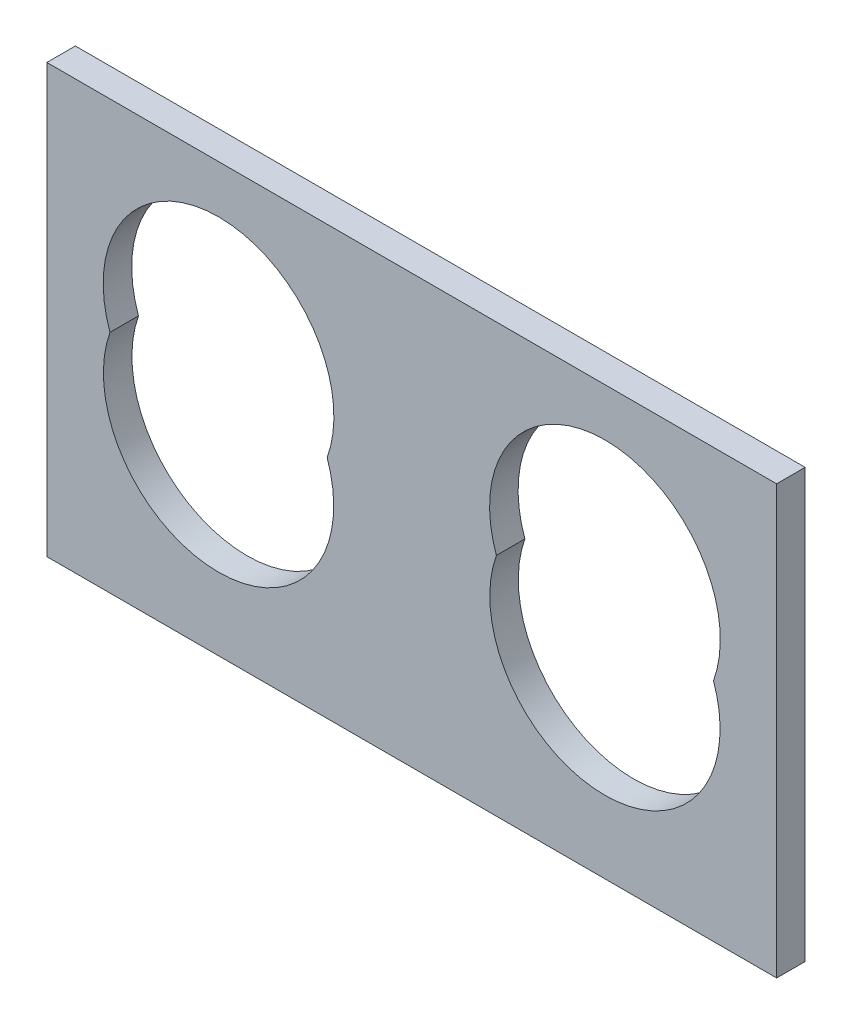
ISO-10303-21;
HEADER;
FILE_DESCRIPTION(('STEP AP214'),'2;1');
FILE_NAME('part.step','',(''),(''),'','','');
FILE_SCHEMA(('AUTOMOTIVE_DESIGN { 1 0 10303 214 1 1 1 1 }'));
ENDSEC;
DATA;
#1=APPLICATION_CONTEXT('core data for automotive mechanical design processes');
#2=APPLICATION_PROTOCOL_DEFINITION('international standard','automotive_design',2000,#1);
#3=PRODUCT_CONTEXT('',#1,'mechanical');
#4=PRODUCT('Part','Part','',(#3));
#5=PRODUCT_RELATED_PRODUCT_CATEGORY('part','',(#4));
#6=PRODUCT_DEFINITION_FORMATION('','',#4);
#7=PRODUCT_DEFINITION_CONTEXT('part definition',#1,'design');
#8=PRODUCT_DEFINITION('design','',#6,#7);
#9=PRODUCT_DEFINITION_SHAPE('','',#8);
#10=(LENGTH_UNIT() NAMED_UNIT(*) SI_UNIT(.MILLI.,.METRE.));
#11=(NAMED_UNIT(*) PLANE_ANGLE_UNIT() SI_UNIT($,.RADIAN.));
#12=(NAMED_UNIT(*) SI_UNIT($,.STERADIAN.) SOLID_ANGLE_UNIT());
#13=UNCERTAINTY_MEASURE_WITH_UNIT(LENGTH_MEASURE(1.E-05),#10,'distance_accuracy_value','');
#14=(GEOMETRIC_REPRESENTATION_CONTEXT(3) GLOBAL_UNCERTAINTY_ASSIGNED_CONTEXT((#13)) GLOBAL_UNIT_ASSIGNED_CONTEXT((#10,
#11,#12)) REPRESENTATION_CONTEXT('',''));
#15=CARTESIAN_POINT('',(0.,0.,0.));
#16=DIRECTION('',(0.,0.,1.));
#17=DIRECTION('',(1.,0.,0.));
#18=AXIS2_PLACEMENT_3D('',#15,#16,#17);
#19=CARTESIAN_POINT('',(-4.50000190126662,2.42973090307518,5.));
#20=DIRECTION('',(0.,0.,-1.));
#21=DIRECTION('',(-1.,0.,0.));
#22=AXIS2_PLACEMENT_3D('',#19,#20,#21);
#23=CYLINDRICAL_SURFACE('',#22,20.1998483211657);
#24=CARTESIAN_POINT('',(-4.50000190126662,2.42973090307518,0.));
#25=DIRECTION('',(0.,0.,1.));
#26=DIRECTION('',(1.,0.,0.));
#27=AXIS2_PLACEMENT_3D('',#24,#25,#26);
#28=CIRCLE('',#27,20.1998483211657);
#29=CARTESIAN_POINT('',(-23.5464817883785,9.15769315831589,0.));
#30=VERTEX_POINT('',#29);
#31=CARTESIAN_POINT('',(14.5464383030136,9.15780549710871,0.));
#32=VERTEX_POINT('',#31);
#33=EDGE_CURVE('E159',#30,#32,#28,.T.);
#34=ORIENTED_EDGE('',*,*,#33,.F.);
#35=DIRECTION('',(0.,0.,-1.));
#36=VECTOR('',#35,1.);
#37=CARTESIAN_POINT('',(-23.5464817883785,9.15769315831589,5.));
#38=LINE('',#37,#36);
#39=CARTESIAN_POINT('',(-23.5464817883785,9.15769315831589,5.));
#40=VERTEX_POINT('',#39);
#41=EDGE_CURVE('E11',#40,#30,#38,.T.);
#42=ORIENTED_EDGE('',*,*,#41,.F.);
#43=CARTESIAN_POINT('',(-4.50000190126662,2.42973090307518,5.));
#44=DIRECTION('',(0.,0.,1.));
#45=DIRECTION('',(1.,0.,0.));
#46=AXIS2_PLACEMENT_3D('',#43,#44,#45);
#47=CIRCLE('',#46,20.1998483211657);
#48=CARTESIAN_POINT('',(14.5464383030136,9.15780549710871,5.));
#49=VERTEX_POINT('',#48);
#50=EDGE_CURVE('E117',#40,#49,#47,.T.);
#51=ORIENTED_EDGE('',*,*,#50,.T.);
#52=DIRECTION('',(0.,0.,-1.));
#53=VECTOR('',#52,1.);
#54=CARTESIAN_POINT('',(14.5464383030136,9.15780549710871,5.));
#55=LINE('',#54,#53);
#56=EDGE_CURVE('E45',#49,#32,#55,.T.);
#57=ORIENTED_EDGE('',*,*,#56,.T.);
#58=EDGE_LOOP('',(#34,#42,#51,#57));
#59=FACE_BOUND('',#58,.T.);
#60=ADVANCED_FACE('F35',(#59),#23,.F.);
#61=CARTESIAN_POINT('',(0.,44.6200004768371,5.));
#62=DIRECTION('',(0.,1.,0.));
#63=DIRECTION('',(0.,0.,1.));
#64=AXIS2_PLACEMENT_3D('',#61,#62,#63);
#65=PLANE('',#64);
#66=DIRECTION('',(1.,0.,0.));
#67=VECTOR('',#66,1.);
#68=CARTESIAN_POINT('',(0.,44.6200004768371,0.));
#69=LINE('',#68,#67);
#70=CARTESIAN_POINT('',(-34.6200007003546,44.6200004768371,0.));
#71=VERTEX_POINT('',#70);
#72=CARTESIAN_POINT('',(93.404548556018,44.6200004768371,0.));
#73=VERTEX_POINT('',#72);
#74=EDGE_CURVE('E150',#71,#73,#69,.T.);
#75=ORIENTED_EDGE('',*,*,#74,.F.);
#76=DIRECTION('',(0.,0.,-1.));
#77=VECTOR('',#76,1.);
#78=CARTESIAN_POINT('',(-34.6200007003546,44.6200004768371,5.));
#79=LINE('',#78,#77);
#80=CARTESIAN_POINT('',(-34.6200007003546,44.6200004768371,5.));
#81=VERTEX_POINT('',#80);
#82=EDGE_CURVE('E129',#81,#71,#79,.T.);
#83=ORIENTED_EDGE('',*,*,#82,.F.);
#84=DIRECTION('',(1.,0.,0.));
#85=VECTOR('',#84,1.);
#86=CARTESIAN_POINT('',(0.,44.6200004768371,5.));
#87=LINE('',#86,#85);
#88=CARTESIAN_POINT('',(93.404548556018,44.6200004768371,5.));
#89=VERTEX_POINT('',#88);
#90=EDGE_CURVE('E110',#81,#89,#87,.T.);
#91=ORIENTED_EDGE('',*,*,#90,.T.);
#92=DIRECTION('',(0.,0.,-1.));
#93=VECTOR('',#92,1.);
#94=CARTESIAN_POINT('',(93.404548556018,44.6200004768371,5.));
#95=LINE('',#94,#93);
#96=EDGE_CURVE('E120',#89,#73,#95,.T.);
#97=ORIENTED_EDGE('',*,*,#96,.T.);
#98=EDGE_LOOP('',(#75,#83,#91,#97));
#99=FACE_BOUND('',#98,.T.);
#100=ADVANCED_FACE('F128',(#99),#65,.T.);
#101=CARTESIAN_POINT('',(-34.6200007003546,0.,5.));
#102=DIRECTION('',(-1.,0.,0.));
#103=DIRECTION('',(0.,0.,1.));
#104=AXIS2_PLACEMENT_3D('',#101,#102,#103);
#105=PLANE('',#104);
#106=DIRECTION('',(0.,1.,0.));
#107=VECTOR('',#106,1.);
#108=CARTESIAN_POINT('',(-34.6200007003546,0.,0.));
#109=LINE('',#108,#107);
#110=CARTESIAN_POINT('',(-34.6200007003546,-30.4650000286103,0.));
#111=VERTEX_POINT('',#110);
#112=EDGE_CURVE('E152',#111,#71,#109,.T.);
#113=ORIENTED_EDGE('',*,*,#112,.F.);
#114=DIRECTION('',(0.,0.,-1.));
#115=VECTOR('',#114,1.);
#116=CARTESIAN_POINT('',(-34.6200007003546,-30.4650000286103,5.));
#117=LINE('',#116,#115);
#118=CARTESIAN_POINT('',(-34.6200007003546,-30.4650000286103,5.));
#119=VERTEX_POINT('',#118);
#120=EDGE_CURVE('E166',#119,#111,#117,.T.);
#121=ORIENTED_EDGE('',*,*,#120,.F.);
#122=DIRECTION('',(0.,1.,0.));
#123=VECTOR('',#122,1.);
#124=CARTESIAN_POINT('',(-34.6200007003546,0.,5.));
#125=LINE('',#124,#123);
#126=EDGE_CURVE('E130',#119,#81,#125,.T.);
#127=ORIENTED_EDGE('',*,*,#126,.T.);
#128=ORIENTED_EDGE('',*,*,#82,.T.);
#129=EDGE_LOOP('',(#113,#121,#127,#128));
#130=FACE_BOUND('',#129,.T.);
#131=ADVANCED_FACE('F192',(#130),#105,.T.);
#132=CARTESIAN_POINT('',(0.,-30.4650000286103,5.));
#133=DIRECTION('',(0.,1.,0.));
#134=DIRECTION('',(0.,0.,1.));
#135=AXIS2_PLACEMENT_3D('',#132,#133,#134);
#136=PLANE('',#135);
#137=DIRECTION('',(1.,0.,0.));
#138=VECTOR('',#137,1.);
#139=CARTESIAN_POINT('',(0.,-30.4650000286103,0.));
#140=LINE('',#139,#138);
#141=CARTESIAN_POINT('',(93.404548556018,-30.4650000286103,0.));
#142=VERTEX_POINT('',#141);
#143=EDGE_CURVE('E155',#111,#142,#140,.T.);
#144=ORIENTED_EDGE('',*,*,#143,.T.);
#145=DIRECTION('',(0.,0.,-1.));
#146=VECTOR('',#145,1.);
#147=CARTESIAN_POINT('',(93.404548556018,-30.4650000286103,5.));
#148=LINE('',#147,#146);
#149=CARTESIAN_POINT('',(93.404548556018,-30.4650000286103,5.));
#150=VERTEX_POINT('',#149);
#151=EDGE_CURVE('E126',#150,#142,#148,.T.);
#152=ORIENTED_EDGE('',*,*,#151,.F.);
#153=DIRECTION('',(1.,0.,0.));
#154=VECTOR('',#153,1.);
#155=CARTESIAN_POINT('',(0.,-30.4650000286103,5.));
#156=LINE('',#155,#154);
#157=EDGE_CURVE('E113',#119,#150,#156,.T.);
#158=ORIENTED_EDGE('',*,*,#157,.F.);
#159=ORIENTED_EDGE('',*,*,#120,.T.);
#160=EDGE_LOOP('',(#144,#152,#158,#159));
#161=FACE_BOUND('',#160,.T.);
#162=ADVANCED_FACE('F197',(#161),#136,.F.);
#163=CARTESIAN_POINT('',(63.2845897595525,15.9942054839587,5.));
#164=DIRECTION('',(0.,0.,-1.));
#165=DIRECTION('',(-1.,0.,0.));
#166=AXIS2_PLACEMENT_3D('',#163,#164,#165);
#167=CYLINDRICAL_SURFACE('',#166,20.2362242785589);
#168=CARTESIAN_POINT('',(63.2845897595525,15.9942054839587,0.));
#169=DIRECTION('',(0.,0.,1.));
#170=DIRECTION('',(1.,0.,0.));
#171=AXIS2_PLACEMENT_3D('',#168,#169,#170);
#172=CIRCLE('',#171,20.2362242785589);
#173=CARTESIAN_POINT('',(82.3310296440419,9.15769315831588,0.));
#174=VERTEX_POINT('',#173);
#175=CARTESIAN_POINT('',(44.2381095526499,9.15780549710872,0.));
#176=VERTEX_POINT('',#175);
#177=EDGE_CURVE('E144',#174,#176,#172,.T.);
#178=ORIENTED_EDGE('',*,*,#177,.F.);
#179=DIRECTION('',(0.,0.,-1.));
#180=VECTOR('',#179,1.);
#181=CARTESIAN_POINT('',(82.3310296440419,9.15769315831588,5.));
#182=LINE('',#181,#180);
#183=CARTESIAN_POINT('',(82.3310296440419,9.15769315831588,5.));
#184=VERTEX_POINT('',#183);
#185=EDGE_CURVE('E39',#184,#174,#182,.T.);
#186=ORIENTED_EDGE('',*,*,#185,.F.);
#187=CARTESIAN_POINT('',(63.2845897595525,15.9942054839587,5.));
#188=DIRECTION('',(0.,0.,1.));
#189=DIRECTION('',(1.,0.,0.));
#190=AXIS2_PLACEMENT_3D('',#187,#188,#189);
#191=CIRCLE('',#190,20.2362242785589);
#192=CARTESIAN_POINT('',(44.2381095526499,9.15780549710872,5.));
#193=VERTEX_POINT('',#192);
#194=EDGE_CURVE('E135',#184,#193,#191,.T.);
#195=ORIENTED_EDGE('',*,*,#194,.T.);
#196=DIRECTION('',(0.,0.,-1.));
#197=VECTOR('',#196,1.);
#198=CARTESIAN_POINT('',(44.2381095526499,9.15780549710872,5.));
#199=LINE('',#198,#197);
#200=EDGE_CURVE('E143',#193,#176,#199,.T.);
#201=ORIENTED_EDGE('',*,*,#200,.T.);
#202=EDGE_LOOP('',(#178,#186,#195,#201));
#203=FACE_BOUND('',#202,.T.);
#204=ADVANCED_FACE('F37',(#203),#167,.F.);
#205=CARTESIAN_POINT('',(93.404548556018,0.,5.));
#206=DIRECTION('',(-1.,0.,0.));
#207=DIRECTION('',(0.,0.,1.));
#208=AXIS2_PLACEMENT_3D('',#205,#206,#207);
#209=PLANE('',#208);
#210=DIRECTION('',(0.,1.,0.));
#211=VECTOR('',#210,1.);
#212=CARTESIAN_POINT('',(93.404548556018,0.,0.));
#213=LINE('',#212,#211);
#214=EDGE_CURVE('E122',#142,#73,#213,.T.);
#215=ORIENTED_EDGE('',*,*,#214,.T.);
#216=ORIENTED_EDGE('',*,*,#96,.F.);
#217=DIRECTION('',(0.,1.,0.));
#218=VECTOR('',#217,1.);
#219=CARTESIAN_POINT('',(93.404548556018,0.,5.));
#220=LINE('',#219,#218);
#221=EDGE_CURVE('E104',#150,#89,#220,.T.);
#222=ORIENTED_EDGE('',*,*,#221,.F.);
#223=ORIENTED_EDGE('',*,*,#151,.T.);
#224=EDGE_LOOP('',(#215,#216,#222,#223));
#225=FACE_BOUND('',#224,.T.);
#226=ADVANCED_FACE('F121',(#225),#209,.F.);
#227=CARTESIAN_POINT('',(63.28454975693,2.42973090307519,5.));
#228=DIRECTION('',(0.,0.,-1.));
#229=DIRECTION('',(-1.,0.,0.));
#230=AXIS2_PLACEMENT_3D('',#227,#228,#229);
#231=CYLINDRICAL_SURFACE('',#230,20.1998483211657);
#232=CARTESIAN_POINT('',(63.28454975693,2.42973090307519,0.));
#233=DIRECTION('',(0.,0.,1.));
#234=DIRECTION('',(1.,0.,0.));
#235=AXIS2_PLACEMENT_3D('',#232,#233,#234);
#236=CIRCLE('',#235,20.1998483211657);
#237=EDGE_CURVE('E147',#176,#174,#236,.T.);
#238=ORIENTED_EDGE('',*,*,#237,.F.);
#239=ORIENTED_EDGE('',*,*,#200,.F.);
#240=CARTESIAN_POINT('',(63.28454975693,2.42973090307519,5.));
#241=DIRECTION('',(0.,0.,1.));
#242=DIRECTION('',(1.,0.,0.));
#243=AXIS2_PLACEMENT_3D('',#240,#241,#242);
#244=CIRCLE('',#243,20.1998483211657);
#245=EDGE_CURVE('E131',#193,#184,#244,.T.);
#246=ORIENTED_EDGE('',*,*,#245,.T.);
#247=ORIENTED_EDGE('',*,*,#185,.T.);
#248=EDGE_LOOP('',(#238,#239,#246,#247));
#249=FACE_BOUND('',#248,.T.);
#250=ADVANCED_FACE('F170',(#249),#231,.F.);
#251=CARTESIAN_POINT('',(-4.50004190388904,15.9942054839587,5.));
#252=DIRECTION('',(0.,0.,-1.));
#253=DIRECTION('',(-1.,0.,0.));
#254=AXIS2_PLACEMENT_3D('',#251,#252,#253);
#255=CYLINDRICAL_SURFACE('',#254,20.2362242785589);
#256=CARTESIAN_POINT('',(-4.50004190388904,15.9942054839587,0.));
#257=DIRECTION('',(0.,0.,1.));
#258=DIRECTION('',(1.,0.,0.));
#259=AXIS2_PLACEMENT_3D('',#256,#257,#258);
#260=CIRCLE('',#259,20.2362242785589);
#261=EDGE_CURVE('E161',#32,#30,#260,.T.);
#262=ORIENTED_EDGE('',*,*,#261,.F.);
#263=ORIENTED_EDGE('',*,*,#56,.F.);
#264=CARTESIAN_POINT('',(-4.50004190388904,15.9942054839587,5.));
#265=DIRECTION('',(0.,0.,1.));
#266=DIRECTION('',(1.,0.,0.));
#267=AXIS2_PLACEMENT_3D('',#264,#265,#266);
#268=CIRCLE('',#267,20.2362242785589);
#269=EDGE_CURVE('E141',#49,#40,#268,.T.);
#270=ORIENTED_EDGE('',*,*,#269,.T.);
#271=ORIENTED_EDGE('',*,*,#41,.T.);
#272=EDGE_LOOP('',(#262,#263,#270,#271));
#273=FACE_BOUND('',#272,.T.);
#274=ADVANCED_FACE('F178',(#273),#255,.F.);
#275=CARTESIAN_POINT('',(0.,0.,5.));
#276=DIRECTION('',(0.,0.,1.));
#277=DIRECTION('',(1.,0.,0.));
#278=AXIS2_PLACEMENT_3D('',#275,#276,#277);
#279=PLANE('',#278);
#280=ORIENTED_EDGE('',*,*,#194,.F.);
#281=ORIENTED_EDGE('',*,*,#245,.F.);
#282=EDGE_LOOP('',(#280,#281));
#283=FACE_BOUND('',#282,.T.);
#284=ORIENTED_EDGE('',*,*,#90,.F.);
#285=ORIENTED_EDGE('',*,*,#126,.F.);
#286=ORIENTED_EDGE('',*,*,#157,.T.);
#287=ORIENTED_EDGE('',*,*,#221,.T.);
#288=EDGE_LOOP('',(#284,#285,#286,#287));
#289=FACE_BOUND('',#288,.T.);
#290=ORIENTED_EDGE('',*,*,#50,.F.);
#291=ORIENTED_EDGE('',*,*,#269,.F.);
#292=EDGE_LOOP('',(#290,#291));
#293=FACE_BOUND('',#292,.T.);
#294=ADVANCED_FACE('F106',(#283,#289,#293),#279,.T.);
#295=CARTESIAN_POINT('',(0.,0.,0.));
#296=DIRECTION('',(0.,0.,1.));
#297=DIRECTION('',(1.,0.,0.));
#298=AXIS2_PLACEMENT_3D('',#295,#296,#297);
#299=PLANE('',#298);
#300=ORIENTED_EDGE('',*,*,#177,.T.);
#301=ORIENTED_EDGE('',*,*,#237,.T.);
#302=EDGE_LOOP('',(#300,#301));
#303=FACE_BOUND('',#302,.T.);
#304=ORIENTED_EDGE('',*,*,#74,.T.);
#305=ORIENTED_EDGE('',*,*,#214,.F.);
#306=ORIENTED_EDGE('',*,*,#143,.F.);
#307=ORIENTED_EDGE('',*,*,#112,.T.);
#308=EDGE_LOOP('',(#304,#305,#306,#307));
#309=FACE_BOUND('',#308,.T.);
#310=ORIENTED_EDGE('',*,*,#33,.T.);
#311=ORIENTED_EDGE('',*,*,#261,.T.);
#312=EDGE_LOOP('',(#310,#311));
#313=FACE_BOUND('',#312,.T.);
#314=ADVANCED_FACE('F173',(#303,#309,#313),#299,.F.);
#315=CLOSED_SHELL('',(#60,#100,#131,#162,#204,#226,#250,#274,#294,#314));
#316=MANIFOLD_SOLID_BREP('B2',#315);
#317=ADVANCED_BREP_SHAPE_REPRESENTATION('',(#18,#316),#14);
#318=SHAPE_DEFINITION_REPRESENTATION(#9,#317);
ENDSEC;
END-ISO-10303-21;
